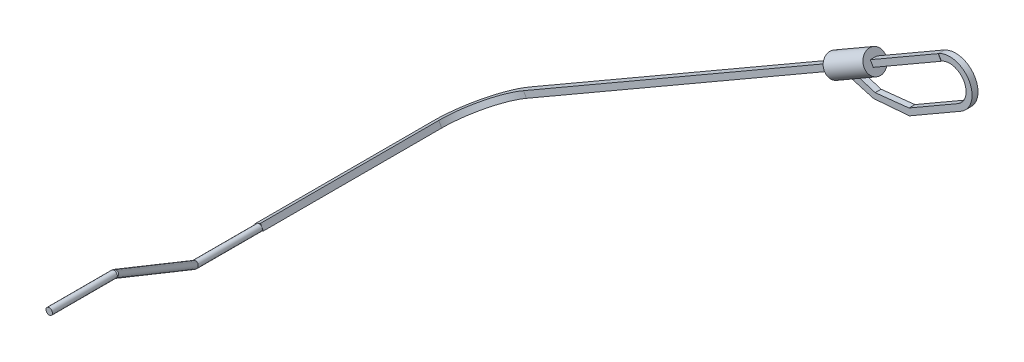
ISO-10303-21;
HEADER;
FILE_DESCRIPTION(('STEP AP214'),'2;1');
FILE_NAME('part.step','',(''),(''),'','','');
FILE_SCHEMA(('AUTOMOTIVE_DESIGN { 1 0 10303 214 1 1 1 1 }'));
ENDSEC;
DATA;
#1=APPLICATION_CONTEXT('core data for automotive mechanical design processes');
#2=APPLICATION_PROTOCOL_DEFINITION('international standard','automotive_design',2000,#1);
#3=PRODUCT_CONTEXT('',#1,'mechanical');
#4=PRODUCT('Part','Part','',(#3));
#5=PRODUCT_RELATED_PRODUCT_CATEGORY('part','',(#4));
#6=PRODUCT_DEFINITION_FORMATION('','',#4);
#7=PRODUCT_DEFINITION_CONTEXT('part definition',#1,'design');
#8=PRODUCT_DEFINITION('design','',#6,#7);
#9=PRODUCT_DEFINITION_SHAPE('','',#8);
#10=(LENGTH_UNIT() NAMED_UNIT(*) SI_UNIT(.MILLI.,.METRE.));
#11=(NAMED_UNIT(*) PLANE_ANGLE_UNIT() SI_UNIT($,.RADIAN.));
#12=(NAMED_UNIT(*) SI_UNIT($,.STERADIAN.) SOLID_ANGLE_UNIT());
#13=UNCERTAINTY_MEASURE_WITH_UNIT(LENGTH_MEASURE(1.E-05),#10,'distance_accuracy_value','');
#14=(GEOMETRIC_REPRESENTATION_CONTEXT(3) GLOBAL_UNCERTAINTY_ASSIGNED_CONTEXT((#13)) GLOBAL_UNIT_ASSIGNED_CONTEXT((#10,
#11,#12)) REPRESENTATION_CONTEXT('',''));
#15=CARTESIAN_POINT('',(0.,0.,0.));
#16=DIRECTION('',(0.,0.,1.));
#17=DIRECTION('',(1.,0.,0.));
#18=AXIS2_PLACEMENT_3D('',#15,#16,#17);
#19=CARTESIAN_POINT('',(-17.9115334794732,-10.9763139720814,-45.));
#20=DIRECTION('',(0.5,-0.866025403784439,0.));
#21=DIRECTION('',(0.866025403784439,0.5,0.));
#22=AXIS2_PLACEMENT_3D('',#19,#20,#21);
#23=PLANE('',#22);
#24=DIRECTION('',(0.866025403784438,0.5,0.));
#25=VECTOR('',#24,1.);
#26=CARTESIAN_POINT('',(-17.9115334794732,-10.9763139720814,-54.6));
#27=LINE('',#26,#25);
#28=CARTESIAN_POINT('',(-17.9115334794732,-10.9763139720814,-54.6));
#29=VERTEX_POINT('',#28);
#30=CARTESIAN_POINT('',(38.8984344593615,21.8229363100588,-54.6));
#31=VERTEX_POINT('',#30);
#32=EDGE_CURVE('E345',#29,#31,#27,.T.);
#33=ORIENTED_EDGE('',*,*,#32,.T.);
#34=DIRECTION('',(0.,0.,1.));
#35=VECTOR('',#34,1.);
#36=CARTESIAN_POINT('',(38.8984344593615,21.8229363100588,-45.));
#37=LINE('',#36,#35);
#38=CARTESIAN_POINT('',(38.8984344593615,21.8229363100588,-53.4));
#39=VERTEX_POINT('',#38);
#40=EDGE_CURVE('E63',#31,#39,#37,.T.);
#41=ORIENTED_EDGE('',*,*,#40,.T.);
#42=DIRECTION('',(-0.866025403784438,-0.5,0.));
#43=VECTOR('',#42,1.);
#44=CARTESIAN_POINT('',(58.8170187464036,33.3229363100588,-53.4));
#45=LINE('',#44,#43);
#46=CARTESIAN_POINT('',(-17.9115334794732,-10.9763139720814,-53.4));
#47=VERTEX_POINT('',#46);
#48=EDGE_CURVE('E340',#39,#47,#45,.T.);
#49=ORIENTED_EDGE('',*,*,#48,.T.);
#50=CARTESIAN_POINT('',(-17.9115334794732,-10.9763139720814,-45.));
#51=DIRECTION('',(-0.5,0.866025403784439,0.));
#52=DIRECTION('',(-0.866025403784439,-0.5,0.));
#53=AXIS2_PLACEMENT_3D('',#50,#51,#52);
#54=CIRCLE('',#53,8.4);
#55=CARTESIAN_POINT('',(-25.1861468712625,-15.1763139720814,-45.));
#56=VERTEX_POINT('',#55);
#57=EDGE_CURVE('E335',#47,#56,#54,.T.);
#58=ORIENTED_EDGE('',*,*,#57,.T.);
#59=DIRECTION('',(0.,0.,1.));
#60=VECTOR('',#59,1.);
#61=CARTESIAN_POINT('',(-25.1861468712625,-15.1763139720814,-45.));
#62=LINE('',#61,#60);
#63=CARTESIAN_POINT('',(-25.1861468712625,-15.1763139720814,-12.));
#64=VERTEX_POINT('',#63);
#65=EDGE_CURVE('E329',#56,#64,#62,.T.);
#66=ORIENTED_EDGE('',*,*,#65,.T.);
#67=DIRECTION('',(-0.866025403784439,-0.5,0.));
#68=VECTOR('',#67,1.);
#69=CARTESIAN_POINT('',(-25.1861468712625,-15.1763139720814,-12.));
#70=LINE('',#69,#68);
#71=CARTESIAN_POINT('',(-25.4980965169602,-15.3564181839986,-12.));
#72=VERTEX_POINT('',#71);
#73=EDGE_CURVE('E349',#64,#72,#70,.T.);
#74=ORIENTED_EDGE('',*,*,#73,.T.);
#75=CARTESIAN_POINT('',(-25.9134277101061,-15.5962097601643,-12.));
#76=VERTEX_POINT('',#75);
#77=EDGE_CURVE('E250',#72,#76,#70,.T.);
#78=ORIENTED_EDGE('',*,*,#77,.T.);
#79=CARTESIAN_POINT('',(-26.2253773558038,-15.7763139720814,-12.));
#80=VERTEX_POINT('',#79);
#81=EDGE_CURVE('E313',#76,#80,#70,.T.);
#82=ORIENTED_EDGE('',*,*,#81,.T.);
#83=DIRECTION('',(0.,0.,-1.));
#84=VECTOR('',#83,1.);
#85=CARTESIAN_POINT('',(-26.2253773558038,-15.7763139720814,-12.));
#86=LINE('',#85,#84);
#87=CARTESIAN_POINT('',(-26.2253773558038,-15.7763139720814,-45.));
#88=VERTEX_POINT('',#87);
#89=EDGE_CURVE('E350',#80,#88,#86,.T.);
#90=ORIENTED_EDGE('',*,*,#89,.T.);
#91=CARTESIAN_POINT('',(-17.9115334794732,-10.9763139720814,-45.));
#92=DIRECTION('',(0.5,-0.866025403784439,0.));
#93=DIRECTION('',(0.866025403784439,0.5,0.));
#94=AXIS2_PLACEMENT_3D('',#91,#92,#93);
#95=CIRCLE('',#94,9.6);
#96=EDGE_CURVE('E344',#88,#29,#95,.T.);
#97=ORIENTED_EDGE('',*,*,#96,.T.);
#98=EDGE_LOOP('',(#33,#41,#49,#58,#66,#74,#78,#82,#90,#97));
#99=FACE_BOUND('',#98,.T.);
#100=ADVANCED_FACE('F39',(#99),#23,.T.);
#101=CARTESIAN_POINT('',(-17.9115334794732,-10.9763139720814,-54.6));
#102=DIRECTION('',(0.,0.,1.));
#103=DIRECTION('',(1.,0.,0.));
#104=AXIS2_PLACEMENT_3D('',#101,#102,#103);
#105=PLANE('',#104);
#106=DIRECTION('',(-0.5,0.866025403784439,0.));
#107=VECTOR('',#106,1.);
#108=CARTESIAN_POINT('',(38.8984344593615,21.8229363100588,-54.6));
#109=LINE('',#108,#107);
#110=CARTESIAN_POINT('',(38.3484344593615,22.7755642542217,-54.6));
#111=VERTEX_POINT('',#110);
#112=EDGE_CURVE('E53',#31,#111,#109,.T.);
#113=ORIENTED_EDGE('',*,*,#112,.F.);
#114=ORIENTED_EDGE('',*,*,#32,.F.);
#115=DIRECTION('',(-0.5,0.866025403784438,0.));
#116=VECTOR('',#115,1.);
#117=CARTESIAN_POINT('',(-17.9115334794732,-10.9763139720814,-54.6));
#118=LINE('',#117,#116);
#119=CARTESIAN_POINT('',(-18.4615334794732,-10.0236860279186,-54.6));
#120=VERTEX_POINT('',#119);
#121=EDGE_CURVE('E287',#29,#120,#118,.T.);
#122=ORIENTED_EDGE('',*,*,#121,.T.);
#123=DIRECTION('',(0.866025403784438,0.5,0.));
#124=VECTOR('',#123,1.);
#125=CARTESIAN_POINT('',(-18.4615334794732,-10.0236860279186,-54.6));
#126=LINE('',#125,#124);
#127=EDGE_CURVE('E325',#120,#111,#126,.T.);
#128=ORIENTED_EDGE('',*,*,#127,.T.);
#129=EDGE_LOOP('',(#113,#114,#122,#128));
#130=FACE_BOUND('',#129,.T.);
#131=ADVANCED_FACE('F457',(#130),#105,.F.);
#132=CARTESIAN_POINT('',(58.8170187464036,33.3229363100588,-53.4));
#133=DIRECTION('',(0.,0.,-1.));
#134=DIRECTION('',(-1.,0.,0.));
#135=AXIS2_PLACEMENT_3D('',#132,#133,#134);
#136=PLANE('',#135);
#137=DIRECTION('',(0.5,-0.866025403784439,0.));
#138=VECTOR('',#137,1.);
#139=CARTESIAN_POINT('',(38.8984344593615,21.8229363100588,-53.4));
#140=LINE('',#139,#138);
#141=CARTESIAN_POINT('',(38.3484344593615,22.7755642542217,-53.4));
#142=VERTEX_POINT('',#141);
#143=EDGE_CURVE('E420',#142,#39,#140,.T.);
#144=ORIENTED_EDGE('',*,*,#143,.F.);
#145=DIRECTION('',(-0.866025403784438,-0.5,0.));
#146=VECTOR('',#145,1.);
#147=CARTESIAN_POINT('',(58.2670187464036,34.2755642542217,-53.4));
#148=LINE('',#147,#146);
#149=CARTESIAN_POINT('',(-18.4615334794732,-10.0236860279186,-53.4));
#150=VERTEX_POINT('',#149);
#151=EDGE_CURVE('E320',#142,#150,#148,.T.);
#152=ORIENTED_EDGE('',*,*,#151,.T.);
#153=DIRECTION('',(-0.5,0.866025403784438,0.));
#154=VECTOR('',#153,1.);
#155=CARTESIAN_POINT('',(-17.9115334794732,-10.9763139720814,-53.4));
#156=LINE('',#155,#154);
#157=EDGE_CURVE('E296',#47,#150,#156,.T.);
#158=ORIENTED_EDGE('',*,*,#157,.F.);
#159=ORIENTED_EDGE('',*,*,#48,.F.);
#160=EDGE_LOOP('',(#144,#152,#158,#159));
#161=FACE_BOUND('',#160,.T.);
#162=ADVANCED_FACE('F461',(#161),#136,.F.);
#163=CARTESIAN_POINT('',(-18.4615334794732,-10.0236860279186,-45.));
#164=DIRECTION('',(0.5,-0.866025403784439,0.));
#165=DIRECTION('',(0.866025403784439,0.5,0.));
#166=AXIS2_PLACEMENT_3D('',#163,#164,#165);
#167=PLANE('',#166);
#168=DIRECTION('',(0.,0.,1.));
#169=VECTOR('',#168,1.);
#170=CARTESIAN_POINT('',(38.3484344593615,22.7755642542217,-45.));
#171=LINE('',#170,#169);
#172=EDGE_CURVE('E50',#111,#142,#171,.T.);
#173=ORIENTED_EDGE('',*,*,#172,.F.);
#174=ORIENTED_EDGE('',*,*,#127,.F.);
#175=CARTESIAN_POINT('',(-18.4615334794732,-10.0236860279186,-45.));
#176=DIRECTION('',(0.5,-0.866025403784439,0.));
#177=DIRECTION('',(0.866025403784439,0.5,0.));
#178=AXIS2_PLACEMENT_3D('',#175,#176,#177);
#179=CIRCLE('',#178,9.6);
#180=CARTESIAN_POINT('',(-26.7753773558038,-14.8236860279186,-45.));
#181=VERTEX_POINT('',#180);
#182=EDGE_CURVE('E324',#181,#120,#179,.T.);
#183=ORIENTED_EDGE('',*,*,#182,.F.);
#184=DIRECTION('',(0.,0.,-1.));
#185=VECTOR('',#184,1.);
#186=CARTESIAN_POINT('',(-26.7753773558038,-14.8236860279186,-12.));
#187=LINE('',#186,#185);
#188=CARTESIAN_POINT('',(-26.7753773558038,-14.8236860279186,-12.));
#189=VERTEX_POINT('',#188);
#190=EDGE_CURVE('E330',#189,#181,#187,.T.);
#191=ORIENTED_EDGE('',*,*,#190,.F.);
#192=DIRECTION('',(-0.866025403784439,-0.5,0.));
#193=VECTOR('',#192,1.);
#194=CARTESIAN_POINT('',(-25.7361468712625,-14.2236860279186,-12.));
#195=LINE('',#194,#193);
#196=CARTESIAN_POINT('',(-26.4634277101061,-14.6435818160014,-12.));
#197=VERTEX_POINT('',#196);
#198=EDGE_CURVE('E249',#197,#189,#195,.T.);
#199=ORIENTED_EDGE('',*,*,#198,.F.);
#200=CARTESIAN_POINT('',(-26.0480965169602,-14.4037902398357,-12.));
#201=VERTEX_POINT('',#200);
#202=EDGE_CURVE('E242',#201,#197,#195,.T.);
#203=ORIENTED_EDGE('',*,*,#202,.F.);
#204=CARTESIAN_POINT('',(-25.7361468712625,-14.2236860279186,-12.));
#205=VERTEX_POINT('',#204);
#206=EDGE_CURVE('E247',#205,#201,#195,.T.);
#207=ORIENTED_EDGE('',*,*,#206,.F.);
#208=DIRECTION('',(0.,0.,1.));
#209=VECTOR('',#208,1.);
#210=CARTESIAN_POINT('',(-25.7361468712625,-14.2236860279186,-45.));
#211=LINE('',#210,#209);
#212=CARTESIAN_POINT('',(-25.7361468712625,-14.2236860279186,-45.));
#213=VERTEX_POINT('',#212);
#214=EDGE_CURVE('E306',#213,#205,#211,.T.);
#215=ORIENTED_EDGE('',*,*,#214,.F.);
#216=CARTESIAN_POINT('',(-18.4615334794732,-10.0236860279186,-45.));
#217=DIRECTION('',(-0.5,0.866025403784439,0.));
#218=DIRECTION('',(-0.866025403784439,-0.5,0.));
#219=AXIS2_PLACEMENT_3D('',#216,#217,#218);
#220=CIRCLE('',#219,8.4);
#221=EDGE_CURVE('E315',#150,#213,#220,.T.);
#222=ORIENTED_EDGE('',*,*,#221,.F.);
#223=ORIENTED_EDGE('',*,*,#151,.F.);
#224=EDGE_LOOP('',(#173,#174,#183,#191,#199,#203,#207,#215,#222,#223));
#225=FACE_BOUND('',#224,.T.);
#226=ADVANCED_FACE('F587',(#225),#167,.F.);
#227=CARTESIAN_POINT('',(-25.9807621135332,-15.,-12.));
#228=DIRECTION('',(0.,0.,1.));
#229=DIRECTION('',(1.,0.,0.));
#230=AXIS2_PLACEMENT_3D('',#227,#228,#229);
#231=PLANE('',#230);
#232=ORIENTED_EDGE('',*,*,#77,.F.);
#233=CARTESIAN_POINT('',(-25.9807621135332,-15.,-12.));
#234=DIRECTION('',(0.,0.,1.));
#235=DIRECTION('',(1.,0.,0.));
#236=AXIS2_PLACEMENT_3D('',#233,#234,#235);
#237=CIRCLE('',#236,0.6);
#238=EDGE_CURVE('E693',#76,#72,#237,.T.);
#239=ORIENTED_EDGE('',*,*,#238,.F.);
#240=EDGE_LOOP('',(#232,#239));
#241=FACE_BOUND('',#240,.T.);
#242=ADVANCED_FACE('F594',(#241),#231,.F.);
#243=CARTESIAN_POINT('',(-14.8540210311235,2.08759651440099,25.9598688092173));
#244=DIRECTION('',(-0.337064867756065,-0.517638400744404,-0.78640813894527));
#245=DIRECTION('',(0.,0.835288001955604,-0.549812653354772));
#246=AXIS2_PLACEMENT_3D('',#243,#244,#245);
#247=CYLINDRICAL_SURFACE('',#246,0.599999999999997);
#248=CARTESIAN_POINT('',(-14.8540210311235,2.08759651440099,25.9598688092173));
#249=DIRECTION('',(0.337064867756065,0.517638400744404,0.78640813894527));
#250=DIRECTION('',(0.,-0.835288001955604,0.549812653354772));
#251=AXIS2_PLACEMENT_3D('',#248,#249,#250);
#252=CIRCLE('',#251,0.599999999999997);
#253=CARTESIAN_POINT('',(-14.3512212929284,1.76019397429037,25.9598688092173));
#254=VERTEX_POINT('',#253);
#255=CARTESIAN_POINT('',(-15.3568207693187,2.41499905451165,25.9598688092173));
#256=VERTEX_POINT('',#255);
#257=EDGE_CURVE('E270',#254,#256,#252,.T.);
#258=ORIENTED_EDGE('',*,*,#257,.F.);
#259=CARTESIAN_POINT('',(-14.8540210311236,2.08759651440098,25.9598688092173));
#260=DIRECTION('',(-0.178323322060886,-0.273855296345597,-0.945094741003586));
#261=DIRECTION('',(0.515710698082972,0.791988980577008,-0.326796466516034));
#262=AXIS2_PLACEMENT_3D('',#259,#260,#261);
#263=ELLIPSE('',#262,0.634856987314166,0.599999999999998);
#264=EDGE_CURVE('E265',#254,#256,#263,.T.);
#265=ORIENTED_EDGE('',*,*,#264,.T.);
#266=EDGE_LOOP('',(#258,#265));
#267=FACE_BOUND('',#266,.T.);
#268=CARTESIAN_POINT('',(-25.9807621135332,-15.,0.));
#269=DIRECTION('',(-0.178323322060886,-0.273855296345597,-0.945094741003586));
#270=DIRECTION('',(-0.515710698082972,-0.791988980577008,0.326796466516034));
#271=AXIS2_PLACEMENT_3D('',#268,#269,#270);
#272=ELLIPSE('',#271,0.634856987314166,0.599999999999998);
#273=CARTESIAN_POINT('',(-26.4835618517283,-14.6725974598894,0.));
#274=VERTEX_POINT('',#273);
#275=CARTESIAN_POINT('',(-25.477962375338,-15.3274025401106,0.));
#276=VERTEX_POINT('',#275);
#277=EDGE_CURVE('E271',#274,#276,#272,.T.);
#278=ORIENTED_EDGE('',*,*,#277,.F.);
#279=CARTESIAN_POINT('',(-25.9807621135332,-15.,0.));
#280=DIRECTION('',(0.337064867756065,0.517638400744404,0.78640813894527));
#281=DIRECTION('',(0.,-0.835288001955604,0.549812653354772));
#282=AXIS2_PLACEMENT_3D('',#279,#280,#281);
#283=CIRCLE('',#282,0.599999999999997);
#284=EDGE_CURVE('E268',#274,#276,#283,.T.);
#285=ORIENTED_EDGE('',*,*,#284,.T.);
#286=EDGE_LOOP('',(#278,#285));
#287=FACE_BOUND('',#286,.T.);
#288=ADVANCED_FACE('F715',(#267,#287),#247,.T.);
#289=CARTESIAN_POINT('',(-14.8540210311236,2.08759651440098,37.9598688092173));
#290=DIRECTION('',(0.,0.,-1.));
#291=DIRECTION('',(-1.,0.,0.));
#292=AXIS2_PLACEMENT_3D('',#289,#290,#291);
#293=CYLINDRICAL_SURFACE('',#292,0.6);
#294=CARTESIAN_POINT('',(-14.8540210311236,2.08759651440098,37.9598688092173));
#295=DIRECTION('',(0.,0.,1.));
#296=DIRECTION('',(1.,0.,0.));
#297=AXIS2_PLACEMENT_3D('',#294,#295,#296);
#298=CIRCLE('',#297,0.6);
#299=CARTESIAN_POINT('',(-14.2540210311236,2.08759651440098,37.9598688092173));
#300=VERTEX_POINT('',#299);
#301=EDGE_CURVE('E256',#300,#300,#298,.T.);
#302=ORIENTED_EDGE('',*,*,#301,.F.);
#303=EDGE_LOOP('',(#302));
#304=FACE_BOUND('',#303,.T.);
#305=ORIENTED_EDGE('',*,*,#264,.F.);
#306=CARTESIAN_POINT('',(-14.8540210311236,2.08759651440098,25.9598688092173));
#307=DIRECTION('',(0.,0.,1.));
#308=DIRECTION('',(1.,0.,0.));
#309=AXIS2_PLACEMENT_3D('',#306,#307,#308);
#310=CIRCLE('',#309,0.6);
#311=EDGE_CURVE('E259',#254,#256,#310,.T.);
#312=ORIENTED_EDGE('',*,*,#311,.T.);
#313=EDGE_LOOP('',(#305,#312));
#314=FACE_BOUND('',#313,.T.);
#315=ADVANCED_FACE('F41',(#304,#314),#293,.T.);
#316=CARTESIAN_POINT('',(-14.8540210311236,2.08759651440098,37.9598688092173));
#317=DIRECTION('',(0.,0.,1.));
#318=DIRECTION('',(1.,0.,0.));
#319=AXIS2_PLACEMENT_3D('',#316,#317,#318);
#320=PLANE('',#319);
#321=ORIENTED_EDGE('',*,*,#301,.T.);
#322=EDGE_LOOP('',(#321));
#323=FACE_BOUND('',#322,.T.);
#324=ADVANCED_FACE('F861',(#323),#320,.T.);
#325=CARTESIAN_POINT('',(-14.8540210311236,2.08759651440098,25.9598688092173));
#326=DIRECTION('',(0.,0.,1.));
#327=DIRECTION('',(1.,0.,0.));
#328=AXIS2_PLACEMENT_3D('',#325,#326,#327);
#329=PLANE('',#328);
#330=ORIENTED_EDGE('',*,*,#311,.F.);
#331=DIRECTION('',(-0.837999563658564,0.545670900184404,0.));
#332=VECTOR('',#331,1.);
#333=CARTESIAN_POINT('',(-14.8540210311235,2.08759651440101,25.9598688092173));
#334=LINE('',#333,#332);
#335=EDGE_CURVE('E254',#254,#256,#334,.T.);
#336=ORIENTED_EDGE('',*,*,#335,.T.);
#337=EDGE_LOOP('',(#330,#336));
#338=FACE_BOUND('',#337,.T.);
#339=ADVANCED_FACE('F852',(#338),#329,.F.);
#340=CARTESIAN_POINT('',(-14.8540210311235,2.08759651440099,25.9598688092173));
#341=DIRECTION('',(0.337064867756065,0.517638400744404,0.78640813894527));
#342=DIRECTION('',(0.,-0.835288001955604,0.549812653354772));
#343=AXIS2_PLACEMENT_3D('',#340,#341,#342);
#344=PLANE('',#343);
#345=ORIENTED_EDGE('',*,*,#335,.F.);
#346=ORIENTED_EDGE('',*,*,#257,.T.);
#347=EDGE_LOOP('',(#345,#346));
#348=FACE_BOUND('',#347,.T.);
#349=ADVANCED_FACE('F848',(#348),#344,.T.);
#350=CARTESIAN_POINT('',(-25.9807621135332,-15.,0.));
#351=DIRECTION('',(0.337064867756065,0.517638400744404,0.78640813894527));
#352=DIRECTION('',(0.,-0.835288001955604,0.549812653354772));
#353=AXIS2_PLACEMENT_3D('',#350,#351,#352);
#354=PLANE('',#353);
#355=ORIENTED_EDGE('',*,*,#284,.F.);
#356=DIRECTION('',(0.837999563658564,-0.545670900184404,0.));
#357=VECTOR('',#356,1.);
#358=CARTESIAN_POINT('',(-25.9807621135332,-15.,0.));
#359=LINE('',#358,#357);
#360=EDGE_CURVE('E252',#274,#276,#359,.T.);
#361=ORIENTED_EDGE('',*,*,#360,.T.);
#362=EDGE_LOOP('',(#355,#361));
#363=FACE_BOUND('',#362,.T.);
#364=ADVANCED_FACE('F835',(#363),#354,.F.);
#365=CARTESIAN_POINT('',(-25.9807621135332,-15.,0.));
#366=DIRECTION('',(0.,0.,-1.));
#367=DIRECTION('',(-1.,0.,0.));
#368=AXIS2_PLACEMENT_3D('',#365,#366,#367);
#369=CYLINDRICAL_SURFACE('',#368,0.6);
#370=CARTESIAN_POINT('',(-25.4611468712625,-14.7,-12.));
#371=VERTEX_POINT('',#370);
#372=EDGE_CURVE('E277',#371,#201,#237,.T.);
#373=ORIENTED_EDGE('',*,*,#372,.T.);
#374=EDGE_CURVE('E276',#201,#197,#237,.T.);
#375=ORIENTED_EDGE('',*,*,#374,.T.);
#376=CARTESIAN_POINT('',(-26.5003773558038,-15.3,-12.));
#377=VERTEX_POINT('',#376);
#378=EDGE_CURVE('E688',#197,#377,#237,.T.);
#379=ORIENTED_EDGE('',*,*,#378,.T.);
#380=EDGE_CURVE('E689',#377,#76,#237,.T.);
#381=ORIENTED_EDGE('',*,*,#380,.T.);
#382=ORIENTED_EDGE('',*,*,#238,.T.);
#383=EDGE_CURVE('E278',#72,#371,#237,.T.);
#384=ORIENTED_EDGE('',*,*,#383,.T.);
#385=EDGE_LOOP('',(#373,#375,#379,#381,#382,#384));
#386=FACE_BOUND('',#385,.T.);
#387=CARTESIAN_POINT('',(-25.9807621135332,-15.,0.));
#388=DIRECTION('',(0.,0.,1.));
#389=DIRECTION('',(1.,0.,0.));
#390=AXIS2_PLACEMENT_3D('',#387,#388,#389);
#391=CIRCLE('',#390,0.6);
#392=EDGE_CURVE('E274',#274,#276,#391,.T.);
#393=ORIENTED_EDGE('',*,*,#392,.F.);
#394=ORIENTED_EDGE('',*,*,#277,.T.);
#395=EDGE_LOOP('',(#393,#394));
#396=FACE_BOUND('',#395,.T.);
#397=ADVANCED_FACE('F695',(#386,#396),#369,.T.);
#398=CARTESIAN_POINT('',(-25.9807621135332,-15.,0.));
#399=DIRECTION('',(0.,0.,1.));
#400=DIRECTION('',(1.,0.,0.));
#401=AXIS2_PLACEMENT_3D('',#398,#399,#400);
#402=PLANE('',#401);
#403=ORIENTED_EDGE('',*,*,#360,.F.);
#404=ORIENTED_EDGE('',*,*,#392,.T.);
#405=EDGE_LOOP('',(#403,#404));
#406=FACE_BOUND('',#405,.T.);
#407=ADVANCED_FACE('F699',(#406),#402,.T.);
#408=ORIENTED_EDGE('',*,*,#374,.F.);
#409=ORIENTED_EDGE('',*,*,#202,.T.);
#410=EDGE_LOOP('',(#408,#409));
#411=FACE_BOUND('',#410,.T.);
#412=ADVANCED_FACE('F700',(#411),#231,.F.);
#413=CARTESIAN_POINT('',(-25.1861468712625,-15.1763139720814,-12.));
#414=DIRECTION('',(0.,0.,-1.));
#415=DIRECTION('',(-1.,0.,0.));
#416=AXIS2_PLACEMENT_3D('',#413,#414,#415);
#417=PLANE('',#416);
#418=ORIENTED_EDGE('',*,*,#378,.F.);
#419=ORIENTED_EDGE('',*,*,#198,.T.);
#420=DIRECTION('',(-0.5,0.866025403784438,0.));
#421=VECTOR('',#420,1.);
#422=CARTESIAN_POINT('',(-26.2253773558038,-15.7763139720814,-12.));
#423=LINE('',#422,#421);
#424=EDGE_CURVE('E284',#377,#189,#423,.T.);
#425=ORIENTED_EDGE('',*,*,#424,.F.);
#426=EDGE_LOOP('',(#418,#419,#425));
#427=FACE_BOUND('',#426,.T.);
#428=ADVANCED_FACE('F684',(#427),#417,.F.);
#429=ORIENTED_EDGE('',*,*,#380,.F.);
#430=EDGE_CURVE('E285',#80,#377,#423,.T.);
#431=ORIENTED_EDGE('',*,*,#430,.F.);
#432=ORIENTED_EDGE('',*,*,#81,.F.);
#433=EDGE_LOOP('',(#429,#431,#432));
#434=FACE_BOUND('',#433,.T.);
#435=ADVANCED_FACE('F704',(#434),#417,.F.);
#436=ORIENTED_EDGE('',*,*,#372,.F.);
#437=DIRECTION('',(-0.5,0.866025403784438,0.));
#438=VECTOR('',#437,1.);
#439=CARTESIAN_POINT('',(-25.1861468712625,-15.1763139720814,-12.));
#440=LINE('',#439,#438);
#441=EDGE_CURVE('E307',#371,#205,#440,.T.);
#442=ORIENTED_EDGE('',*,*,#441,.T.);
#443=ORIENTED_EDGE('',*,*,#206,.T.);
#444=EDGE_LOOP('',(#436,#442,#443));
#445=FACE_BOUND('',#444,.T.);
#446=ADVANCED_FACE('F668',(#445),#417,.F.);
#447=ORIENTED_EDGE('',*,*,#383,.F.);
#448=ORIENTED_EDGE('',*,*,#73,.F.);
#449=EDGE_CURVE('E302',#64,#371,#440,.T.);
#450=ORIENTED_EDGE('',*,*,#449,.T.);
#451=EDGE_LOOP('',(#447,#448,#450));
#452=FACE_BOUND('',#451,.T.);
#453=ADVANCED_FACE('F669',(#452),#417,.F.);
#454=CARTESIAN_POINT('',(-26.2253773558038,-15.7763139720814,-12.));
#455=DIRECTION('',(0.866025403784438,0.5,0.));
#456=DIRECTION('',(-0.5,0.866025403784439,0.));
#457=AXIS2_PLACEMENT_3D('',#454,#455,#456);
#458=PLANE('',#457);
#459=ORIENTED_EDGE('',*,*,#190,.T.);
#460=DIRECTION('',(-0.5,0.866025403784438,0.));
#461=VECTOR('',#460,1.);
#462=CARTESIAN_POINT('',(-26.2253773558038,-15.7763139720814,-45.));
#463=LINE('',#462,#461);
#464=EDGE_CURVE('E288',#88,#181,#463,.T.);
#465=ORIENTED_EDGE('',*,*,#464,.F.);
#466=ORIENTED_EDGE('',*,*,#89,.F.);
#467=ORIENTED_EDGE('',*,*,#430,.T.);
#468=ORIENTED_EDGE('',*,*,#424,.T.);
#469=EDGE_LOOP('',(#459,#465,#466,#467,#468));
#470=FACE_BOUND('',#469,.T.);
#471=ADVANCED_FACE('F649',(#470),#458,.F.);
#472=CARTESIAN_POINT('',(-17.9115334794732,-10.9763139720814,-45.));
#473=DIRECTION('',(-0.5,0.866025403784438,0.));
#474=DIRECTION('',(-0.866025403784439,-0.5,0.));
#475=AXIS2_PLACEMENT_3D('',#472,#473,#474);
#476=CYLINDRICAL_SURFACE('',#475,9.6);
#477=ORIENTED_EDGE('',*,*,#182,.T.);
#478=ORIENTED_EDGE('',*,*,#121,.F.);
#479=ORIENTED_EDGE('',*,*,#96,.F.);
#480=ORIENTED_EDGE('',*,*,#464,.T.);
#481=EDGE_LOOP('',(#477,#478,#479,#480));
#482=FACE_BOUND('',#481,.T.);
#483=ADVANCED_FACE('F642',(#482),#476,.T.);
#484=CARTESIAN_POINT('',(-17.9115334794732,-10.9763139720814,-45.));
#485=DIRECTION('',(-0.5,0.866025403784438,0.));
#486=DIRECTION('',(-0.866025403784439,-0.5,0.));
#487=AXIS2_PLACEMENT_3D('',#484,#485,#486);
#488=CYLINDRICAL_SURFACE('',#487,8.4);
#489=ORIENTED_EDGE('',*,*,#221,.T.);
#490=DIRECTION('',(-0.5,0.866025403784438,0.));
#491=VECTOR('',#490,1.);
#492=CARTESIAN_POINT('',(-25.1861468712625,-15.1763139720814,-45.));
#493=LINE('',#492,#491);
#494=EDGE_CURVE('E303',#56,#213,#493,.T.);
#495=ORIENTED_EDGE('',*,*,#494,.F.);
#496=ORIENTED_EDGE('',*,*,#57,.F.);
#497=ORIENTED_EDGE('',*,*,#157,.T.);
#498=EDGE_LOOP('',(#489,#495,#496,#497));
#499=FACE_BOUND('',#498,.T.);
#500=ADVANCED_FACE('F645',(#499),#488,.F.);
#501=CARTESIAN_POINT('',(-25.1861468712625,-15.1763139720814,-45.));
#502=DIRECTION('',(-0.866025403784438,-0.5,0.));
#503=DIRECTION('',(0.5,-0.866025403784439,0.));
#504=AXIS2_PLACEMENT_3D('',#501,#502,#503);
#505=PLANE('',#504);
#506=ORIENTED_EDGE('',*,*,#214,.T.);
#507=ORIENTED_EDGE('',*,*,#441,.F.);
#508=ORIENTED_EDGE('',*,*,#449,.F.);
#509=ORIENTED_EDGE('',*,*,#65,.F.);
#510=ORIENTED_EDGE('',*,*,#494,.T.);
#511=EDGE_LOOP('',(#506,#507,#508,#509,#510));
#512=FACE_BOUND('',#511,.T.);
#513=ADVANCED_FACE('F434',(#512),#505,.F.);
#514=CARTESIAN_POINT('',(45.9846503915292,26.5492502821402,-54.));
#515=DIRECTION('',(-0.866025403784439,-0.5,0.));
#516=DIRECTION('',(0.5,-0.866025403784439,0.));
#517=AXIS2_PLACEMENT_3D('',#514,#515,#516);
#518=CYLINDRICAL_SURFACE('',#517,2.);
#519=CARTESIAN_POINT('',(45.9846503915292,26.5492502821402,-54.));
#520=DIRECTION('',(0.866025403784439,0.5,0.));
#521=DIRECTION('',(-0.5,0.866025403784439,0.));
#522=AXIS2_PLACEMENT_3D('',#519,#520,#521);
#523=CIRCLE('',#522,2.);
#524=CARTESIAN_POINT('',(44.9846503915292,28.2813010897091,-54.));
#525=VERTEX_POINT('',#524);
#526=EDGE_CURVE('E424',#525,#525,#523,.T.);
#527=ORIENTED_EDGE('',*,*,#526,.F.);
#528=EDGE_LOOP('',(#527));
#529=FACE_BOUND('',#528,.T.);
#530=CARTESIAN_POINT('',(38.6234344593615,22.2992502821402,-54.));
#531=DIRECTION('',(0.866025403784439,0.5,0.));
#532=DIRECTION('',(-0.5,0.866025403784439,0.));
#533=AXIS2_PLACEMENT_3D('',#530,#531,#532);
#534=CIRCLE('',#533,2.);
#535=CARTESIAN_POINT('',(37.6234344593615,24.0313010897091,-54.));
#536=VERTEX_POINT('',#535);
#537=EDGE_CURVE('E422',#536,#536,#534,.T.);
#538=ORIENTED_EDGE('',*,*,#537,.T.);
#539=EDGE_LOOP('',(#538));
#540=FACE_BOUND('',#539,.T.);
#541=DIRECTION('',(-0.866025403784439,-0.5,0.));
#542=VECTOR('',#541,1.);
#543=CARTESIAN_POINT('',(46.9460946176807,24.8839800338021,-53.45));
#544=LINE('',#543,#542);
#545=CARTESIAN_POINT('',(42.2656611275311,22.1817304983401,-53.45));
#546=VERTEX_POINT('',#545);
#547=CARTESIAN_POINT('',(43.726376102643,23.0250746824303,-53.45));
#548=VERTEX_POINT('',#547);
#549=EDGE_CURVE('E232',#546,#548,#544,.F.);
#550=ORIENTED_EDGE('',*,*,#549,.T.);
#551=CARTESIAN_POINT('',(41.2215106707148,23.7992502821402,-54.));
#552=DIRECTION('',(-0.295286936198048,-0.955408616933493,0.));
#553=DIRECTION('',(-0.955408616933493,0.295286936198048,0.));
#554=AXIS2_PLACEMENT_3D('',#551,#552,#553);
#555=ELLIPSE('',#554,2.72691216768267,2.);
#556=CARTESIAN_POINT('',(43.726376102643,23.0250746824303,-54.55));
#557=VERTEX_POINT('',#556);
#558=EDGE_CURVE('E239',#548,#557,#555,.F.);
#559=ORIENTED_EDGE('',*,*,#558,.T.);
#560=DIRECTION('',(-0.866025403784439,-0.5,0.));
#561=VECTOR('',#560,1.);
#562=CARTESIAN_POINT('',(46.9460946176807,24.8839800338021,-54.55));
#563=LINE('',#562,#561);
#564=CARTESIAN_POINT('',(42.2656611275311,22.1817304983401,-54.55));
#565=VERTEX_POINT('',#564);
#566=EDGE_CURVE('E238',#565,#557,#563,.F.);
#567=ORIENTED_EDGE('',*,*,#566,.F.);
#568=CARTESIAN_POINT('',(39.679563000562,22.9090063797012,-54.));
#569=DIRECTION('',(0.270723424827323,0.962657170154445,0.));
#570=DIRECTION('',(-0.962657170154445,0.270723424827323,0.));
#571=AXIS2_PLACEMENT_3D('',#568,#569,#570);
#572=ELLIPSE('',#571,2.79414702275506,2.);
#573=EDGE_CURVE('E224',#565,#546,#572,.F.);
#574=ORIENTED_EDGE('',*,*,#573,.T.);
#575=EDGE_LOOP('',(#550,#559,#567,#574));
#576=FACE_BOUND('',#575,.T.);
#577=ADVANCED_FACE('F241',(#529,#540,#576),#518,.T.);
#578=CARTESIAN_POINT('',(45.9846503915292,26.5492502821402,-54.));
#579=DIRECTION('',(0.866025403784439,0.5,0.));
#580=DIRECTION('',(-0.5,0.866025403784439,0.));
#581=AXIS2_PLACEMENT_3D('',#578,#579,#580);
#582=PLANE('',#581);
#583=DIRECTION('',(-0.5,0.866025403784439,0.));
#584=VECTOR('',#583,1.);
#585=CARTESIAN_POINT('',(46.2596503915292,26.0729363100588,-54.6));
#586=LINE('',#585,#584);
#587=CARTESIAN_POINT('',(46.2596503915292,26.0729363100588,-54.6));
#588=VERTEX_POINT('',#587);
#589=CARTESIAN_POINT('',(45.7096503915292,27.0255642542217,-54.6));
#590=VERTEX_POINT('',#589);
#591=EDGE_CURVE('E413',#588,#590,#586,.T.);
#592=ORIENTED_EDGE('',*,*,#591,.F.);
#593=DIRECTION('',(0.,0.,1.));
#594=VECTOR('',#593,1.);
#595=CARTESIAN_POINT('',(46.2596503915292,26.0729363100588,-45.));
#596=LINE('',#595,#594);
#597=CARTESIAN_POINT('',(46.2596503915292,26.0729363100588,-53.4));
#598=VERTEX_POINT('',#597);
#599=EDGE_CURVE('E397',#588,#598,#596,.T.);
#600=ORIENTED_EDGE('',*,*,#599,.T.);
#601=DIRECTION('',(0.5,-0.866025403784439,0.));
#602=VECTOR('',#601,1.);
#603=CARTESIAN_POINT('',(46.2596503915292,26.0729363100588,-53.4));
#604=LINE('',#603,#602);
#605=CARTESIAN_POINT('',(45.7096503915292,27.0255642542217,-53.4));
#606=VERTEX_POINT('',#605);
#607=EDGE_CURVE('E412',#606,#598,#604,.T.);
#608=ORIENTED_EDGE('',*,*,#607,.F.);
#609=DIRECTION('',(0.,0.,1.));
#610=VECTOR('',#609,1.);
#611=CARTESIAN_POINT('',(45.7096503915292,27.0255642542217,-45.));
#612=LINE('',#611,#610);
#613=EDGE_CURVE('E11',#590,#606,#612,.T.);
#614=ORIENTED_EDGE('',*,*,#613,.F.);
#615=EDGE_LOOP('',(#592,#600,#608,#614));
#616=FACE_BOUND('',#615,.T.);
#617=ORIENTED_EDGE('',*,*,#526,.T.);
#618=EDGE_LOOP('',(#617));
#619=FACE_BOUND('',#618,.T.);
#620=ADVANCED_FACE('F431',(#616,#619),#582,.T.);
#621=CARTESIAN_POINT('',(38.6234344593615,22.2992502821402,-54.));
#622=DIRECTION('',(0.866025403784439,0.5,0.));
#623=DIRECTION('',(-0.5,0.866025403784439,0.));
#624=AXIS2_PLACEMENT_3D('',#621,#622,#623);
#625=PLANE('',#624);
#626=ORIENTED_EDGE('',*,*,#40,.F.);
#627=ORIENTED_EDGE('',*,*,#112,.T.);
#628=ORIENTED_EDGE('',*,*,#172,.T.);
#629=ORIENTED_EDGE('',*,*,#143,.T.);
#630=EDGE_LOOP('',(#626,#627,#628,#629));
#631=FACE_BOUND('',#630,.T.);
#632=ORIENTED_EDGE('',*,*,#537,.F.);
#633=EDGE_LOOP('',(#632));
#634=FACE_BOUND('',#633,.T.);
#635=ADVANCED_FACE('F438',(#631,#634),#625,.F.);
#636=CARTESIAN_POINT('',(58.8170187464036,33.3229363100588,-54.6));
#637=DIRECTION('',(-0.866025403784438,-0.5,0.));
#638=DIRECTION('',(0.5,-0.866025403784439,0.));
#639=AXIS2_PLACEMENT_3D('',#636,#637,#638);
#640=PLANE('',#639);
#641=DIRECTION('',(0.5,-0.866025403784439,0.));
#642=VECTOR('',#641,1.);
#643=CARTESIAN_POINT('',(58.8170187464036,33.3229363100588,-53.45));
#644=LINE('',#643,#642);
#645=CARTESIAN_POINT('',(58.2670187464036,34.2755642542217,-53.45));
#646=VERTEX_POINT('',#645);
#647=CARTESIAN_POINT('',(58.8170187464036,33.3229363100588,-53.45));
#648=VERTEX_POINT('',#647);
#649=EDGE_CURVE('E355',#646,#648,#644,.T.);
#650=ORIENTED_EDGE('',*,*,#649,.F.);
#651=DIRECTION('',(0.,0.,1.));
#652=VECTOR('',#651,1.);
#653=CARTESIAN_POINT('',(58.2670187464036,34.2755642542217,-54.6));
#654=LINE('',#653,#652);
#655=CARTESIAN_POINT('',(58.2670187464036,34.2755642542217,-53.4));
#656=VERTEX_POINT('',#655);
#657=EDGE_CURVE('E321',#646,#656,#654,.T.);
#658=ORIENTED_EDGE('',*,*,#657,.T.);
#659=DIRECTION('',(-0.5,0.866025403784438,0.));
#660=VECTOR('',#659,1.);
#661=CARTESIAN_POINT('',(58.8170187464036,33.3229363100588,-53.4));
#662=LINE('',#661,#660);
#663=CARTESIAN_POINT('',(58.8170187464036,33.3229363100588,-53.4));
#664=VERTEX_POINT('',#663);
#665=EDGE_CURVE('E293',#664,#656,#662,.T.);
#666=ORIENTED_EDGE('',*,*,#665,.F.);
#667=DIRECTION('',(0.,0.,1.));
#668=VECTOR('',#667,1.);
#669=CARTESIAN_POINT('',(58.8170187464036,33.3229363100588,-54.6));
#670=LINE('',#669,#668);
#671=EDGE_CURVE('E343',#648,#664,#670,.T.);
#672=ORIENTED_EDGE('',*,*,#671,.F.);
#673=EDGE_LOOP('',(#650,#658,#666,#672));
#674=FACE_BOUND('',#673,.T.);
#675=ADVANCED_FACE('F442',(#674),#640,.F.);
#676=CARTESIAN_POINT('',(62.4170187464036,27.0875534028108,-53.45));
#677=DIRECTION('',(-0.5,0.866025403784439,0.));
#678=DIRECTION('',(-0.866025403784439,-0.5,0.));
#679=AXIS2_PLACEMENT_3D('',#676,#677,#678);
#680=PLANE('',#679);
#681=DIRECTION('',(0.866025403784439,0.5,0.));
#682=VECTOR('',#681,1.);
#683=CARTESIAN_POINT('',(62.4170187464036,27.0875534028108,-54.55));
#684=LINE('',#683,#682);
#685=CARTESIAN_POINT('',(52.8907393047748,21.5875534028108,-54.55));
#686=VERTEX_POINT('',#685);
#687=CARTESIAN_POINT('',(62.4170187464036,27.0875534028108,-54.55));
#688=VERTEX_POINT('',#687);
#689=EDGE_CURVE('E383',#686,#688,#684,.T.);
#690=ORIENTED_EDGE('',*,*,#689,.T.);
#691=DIRECTION('',(0.,0.,-1.));
#692=VECTOR('',#691,1.);
#693=CARTESIAN_POINT('',(62.4170187464036,27.0875534028108,-53.45));
#694=LINE('',#693,#692);
#695=CARTESIAN_POINT('',(62.4170187464036,27.0875534028108,-53.45));
#696=VERTEX_POINT('',#695);
#697=EDGE_CURVE('E373',#696,#688,#694,.T.);
#698=ORIENTED_EDGE('',*,*,#697,.F.);
#699=DIRECTION('',(0.866025403784439,0.5,0.));
#700=VECTOR('',#699,1.);
#701=CARTESIAN_POINT('',(62.4170187464036,27.0875534028108,-53.45));
#702=LINE('',#701,#700);
#703=CARTESIAN_POINT('',(52.8907393047748,21.5875534028108,-53.45));
#704=VERTEX_POINT('',#703);
#705=EDGE_CURVE('E402',#704,#696,#702,.T.);
#706=ORIENTED_EDGE('',*,*,#705,.F.);
#707=DIRECTION('',(0.,0.,-1.));
#708=VECTOR('',#707,1.);
#709=CARTESIAN_POINT('',(52.8907393047748,21.5875534028108,-53.45));
#710=LINE('',#709,#708);
#711=EDGE_CURVE('E367',#704,#686,#710,.T.);
#712=ORIENTED_EDGE('',*,*,#711,.T.);
#713=EDGE_LOOP('',(#690,#698,#706,#712));
#714=FACE_BOUND('',#713,.T.);
#715=ADVANCED_FACE('F447',(#714),#680,.F.);
#716=CARTESIAN_POINT('',(60.3420187464036,30.6815588285162,-53.45));
#717=DIRECTION('',(0.,0.,-1.));
#718=DIRECTION('',(-1.,0.,0.));
#719=AXIS2_PLACEMENT_3D('',#716,#717,#718);
#720=CYLINDRICAL_SURFACE('',#719,4.15);
#721=CARTESIAN_POINT('',(60.3420187464036,30.6815588285162,-54.55));
#722=DIRECTION('',(0.,0.,1.));
#723=DIRECTION('',(-1.,0.,0.));
#724=AXIS2_PLACEMENT_3D('',#721,#722,#723);
#725=CIRCLE('',#724,4.15);
#726=CARTESIAN_POINT('',(58.2670187464036,34.2755642542217,-54.55));
#727=VERTEX_POINT('',#726);
#728=EDGE_CURVE('E379',#688,#727,#725,.T.);
#729=ORIENTED_EDGE('',*,*,#728,.T.);
#730=DIRECTION('',(0.,0.,-1.));
#731=VECTOR('',#730,1.);
#732=CARTESIAN_POINT('',(58.2670187464036,34.2755642542217,-53.45));
#733=LINE('',#732,#731);
#734=EDGE_CURVE('E376',#646,#727,#733,.T.);
#735=ORIENTED_EDGE('',*,*,#734,.F.);
#736=CARTESIAN_POINT('',(60.3420187464036,30.6815588285162,-53.45));
#737=DIRECTION('',(0.,0.,1.));
#738=DIRECTION('',(-1.,0.,0.));
#739=AXIS2_PLACEMENT_3D('',#736,#737,#738);
#740=CIRCLE('',#739,4.15);
#741=EDGE_CURVE('E377',#696,#646,#740,.T.);
#742=ORIENTED_EDGE('',*,*,#741,.F.);
#743=ORIENTED_EDGE('',*,*,#697,.T.);
#744=EDGE_LOOP('',(#729,#735,#742,#743));
#745=FACE_BOUND('',#744,.T.);
#746=ADVANCED_FACE('F501',(#745),#720,.T.);
#747=CARTESIAN_POINT('',(58.2670187464036,34.2755642542217,-54.6));
#748=VERTEX_POINT('',#747);
#749=EDGE_CURVE('E318',#748,#727,#654,.T.);
#750=ORIENTED_EDGE('',*,*,#749,.T.);
#751=DIRECTION('',(0.5,-0.866025403784439,0.));
#752=VECTOR('',#751,1.);
#753=CARTESIAN_POINT('',(58.8170187464036,33.3229363100588,-54.55));
#754=LINE('',#753,#752);
#755=CARTESIAN_POINT('',(58.8170187464036,33.3229363100588,-54.55));
#756=VERTEX_POINT('',#755);
#757=EDGE_CURVE('E352',#727,#756,#754,.T.);
#758=ORIENTED_EDGE('',*,*,#757,.T.);
#759=CARTESIAN_POINT('',(58.8170187464036,33.3229363100588,-54.6));
#760=VERTEX_POINT('',#759);
#761=EDGE_CURVE('E336',#760,#756,#670,.T.);
#762=ORIENTED_EDGE('',*,*,#761,.F.);
#763=DIRECTION('',(-0.5,0.866025403784438,0.));
#764=VECTOR('',#763,1.);
#765=CARTESIAN_POINT('',(58.8170187464036,33.3229363100588,-54.6));
#766=LINE('',#765,#764);
#767=EDGE_CURVE('E295',#760,#748,#766,.T.);
#768=ORIENTED_EDGE('',*,*,#767,.T.);
#769=EDGE_LOOP('',(#750,#758,#762,#768));
#770=FACE_BOUND('',#769,.T.);
#771=ADVANCED_FACE('F455',(#770),#640,.F.);
#772=EDGE_CURVE('E322',#590,#748,#126,.T.);
#773=ORIENTED_EDGE('',*,*,#772,.F.);
#774=ORIENTED_EDGE('',*,*,#613,.T.);
#775=EDGE_CURVE('E314',#656,#606,#148,.T.);
#776=ORIENTED_EDGE('',*,*,#775,.F.);
#777=ORIENTED_EDGE('',*,*,#657,.F.);
#778=ORIENTED_EDGE('',*,*,#734,.T.);
#779=ORIENTED_EDGE('',*,*,#749,.F.);
#780=EDGE_LOOP('',(#773,#774,#776,#777,#778,#779));
#781=FACE_BOUND('',#780,.T.);
#782=ADVANCED_FACE('F496',(#781),#167,.F.);
#783=ORIENTED_EDGE('',*,*,#775,.T.);
#784=ORIENTED_EDGE('',*,*,#607,.T.);
#785=EDGE_CURVE('E331',#664,#598,#45,.T.);
#786=ORIENTED_EDGE('',*,*,#785,.F.);
#787=ORIENTED_EDGE('',*,*,#665,.T.);
#788=EDGE_LOOP('',(#783,#784,#786,#787));
#789=FACE_BOUND('',#788,.T.);
#790=ADVANCED_FACE('F476',(#789),#136,.F.);
#791=EDGE_CURVE('E342',#588,#760,#27,.T.);
#792=ORIENTED_EDGE('',*,*,#791,.F.);
#793=ORIENTED_EDGE('',*,*,#591,.T.);
#794=ORIENTED_EDGE('',*,*,#772,.T.);
#795=ORIENTED_EDGE('',*,*,#767,.F.);
#796=EDGE_LOOP('',(#792,#793,#794,#795));
#797=FACE_BOUND('',#796,.T.);
#798=ADVANCED_FACE('F464',(#797),#105,.F.);
#799=ORIENTED_EDGE('',*,*,#599,.F.);
#800=ORIENTED_EDGE('',*,*,#791,.T.);
#801=ORIENTED_EDGE('',*,*,#761,.T.);
#802=DIRECTION('',(0.,0.,-1.));
#803=VECTOR('',#802,1.);
#804=CARTESIAN_POINT('',(58.8170187464036,33.3229363100588,-53.45));
#805=LINE('',#804,#803);
#806=EDGE_CURVE('E360',#648,#756,#805,.T.);
#807=ORIENTED_EDGE('',*,*,#806,.F.);
#808=ORIENTED_EDGE('',*,*,#671,.T.);
#809=ORIENTED_EDGE('',*,*,#785,.T.);
#810=EDGE_LOOP('',(#799,#800,#801,#807,#808,#809));
#811=FACE_BOUND('',#810,.T.);
#812=ADVANCED_FACE('F456',(#811),#23,.T.);
#813=CARTESIAN_POINT('',(60.3420187464036,30.6815588285162,-53.45));
#814=DIRECTION('',(0.,0.,-1.));
#815=DIRECTION('',(-1.,0.,0.));
#816=AXIS2_PLACEMENT_3D('',#813,#814,#815);
#817=CYLINDRICAL_SURFACE('',#816,3.05);
#818=CARTESIAN_POINT('',(60.3420187464036,30.6815588285162,-54.55));
#819=DIRECTION('',(0.,0.,-1.));
#820=DIRECTION('',(1.,0.,0.));
#821=AXIS2_PLACEMENT_3D('',#818,#819,#820);
#822=CIRCLE('',#821,3.05);
#823=CARTESIAN_POINT('',(61.8670187464036,28.0401813469737,-54.55));
#824=VERTEX_POINT('',#823);
#825=EDGE_CURVE('E400',#756,#824,#822,.T.);
#826=ORIENTED_EDGE('',*,*,#825,.T.);
#827=DIRECTION('',(0.,0.,-1.));
#828=VECTOR('',#827,1.);
#829=CARTESIAN_POINT('',(61.8670187464036,28.0401813469737,-53.45));
#830=LINE('',#829,#828);
#831=CARTESIAN_POINT('',(61.8670187464036,28.0401813469737,-53.45));
#832=VERTEX_POINT('',#831);
#833=EDGE_CURVE('E359',#832,#824,#830,.T.);
#834=ORIENTED_EDGE('',*,*,#833,.F.);
#835=CARTESIAN_POINT('',(60.3420187464036,30.6815588285162,-53.45));
#836=DIRECTION('',(0.,0.,-1.));
#837=DIRECTION('',(1.,0.,0.));
#838=AXIS2_PLACEMENT_3D('',#835,#836,#837);
#839=CIRCLE('',#838,3.05);
#840=EDGE_CURVE('E382',#648,#832,#839,.T.);
#841=ORIENTED_EDGE('',*,*,#840,.F.);
#842=ORIENTED_EDGE('',*,*,#806,.T.);
#843=EDGE_LOOP('',(#826,#834,#841,#842));
#844=FACE_BOUND('',#843,.T.);
#845=ADVANCED_FACE('F467',(#844),#817,.F.);
#846=CARTESIAN_POINT('',(52.8170532768562,22.8151813469737,-53.45));
#847=DIRECTION('',(0.5,-0.866025403784439,0.));
#848=DIRECTION('',(0.866025403784439,0.5,0.));
#849=AXIS2_PLACEMENT_3D('',#846,#847,#848);
#850=PLANE('',#849);
#851=DIRECTION('',(-0.866025403784439,-0.5,0.));
#852=VECTOR('',#851,1.);
#853=CARTESIAN_POINT('',(52.8170532768562,22.8151813469737,-54.55));
#854=LINE('',#853,#852);
#855=CARTESIAN_POINT('',(52.8170532768562,22.8151813469737,-54.55));
#856=VERTEX_POINT('',#855);
#857=EDGE_CURVE('E394',#824,#856,#854,.T.);
#858=ORIENTED_EDGE('',*,*,#857,.T.);
#859=DIRECTION('',(0.,0.,-1.));
#860=VECTOR('',#859,1.);
#861=CARTESIAN_POINT('',(52.8170532768562,22.8151813469737,-53.45));
#862=LINE('',#861,#860);
#863=CARTESIAN_POINT('',(52.8170532768562,22.8151813469737,-53.45));
#864=VERTEX_POINT('',#863);
#865=EDGE_CURVE('E361',#864,#856,#862,.T.);
#866=ORIENTED_EDGE('',*,*,#865,.F.);
#867=DIRECTION('',(-0.866025403784439,-0.5,0.));
#868=VECTOR('',#867,1.);
#869=CARTESIAN_POINT('',(52.8170532768562,22.8151813469737,-53.45));
#870=LINE('',#869,#868);
#871=EDGE_CURVE('E410',#832,#864,#870,.T.);
#872=ORIENTED_EDGE('',*,*,#871,.F.);
#873=ORIENTED_EDGE('',*,*,#833,.T.);
#874=EDGE_LOOP('',(#858,#866,#872,#873));
#875=FACE_BOUND('',#874,.T.);
#876=ADVANCED_FACE('F478',(#875),#850,.F.);
#877=CARTESIAN_POINT('',(46.5624072050957,22.148546126624,-53.45));
#878=DIRECTION('',(0.105982136439584,-0.99436803385653,0.));
#879=DIRECTION('',(0.99436803385653,0.105982136439584,0.));
#880=AXIS2_PLACEMENT_3D('',#877,#878,#879);
#881=PLANE('',#880);
#882=DIRECTION('',(-0.99436803385653,-0.105982136439584,0.));
#883=VECTOR('',#882,1.);
#884=CARTESIAN_POINT('',(46.5624072050957,22.148546126624,-54.55));
#885=LINE('',#884,#883);
#886=CARTESIAN_POINT('',(46.5624072050957,22.148546126624,-54.55));
#887=VERTEX_POINT('',#886);
#888=EDGE_CURVE('E391',#856,#887,#885,.T.);
#889=ORIENTED_EDGE('',*,*,#888,.T.);
#890=DIRECTION('',(0.,0.,-1.));
#891=VECTOR('',#890,1.);
#892=CARTESIAN_POINT('',(46.5624072050957,22.148546126624,-53.45));
#893=LINE('',#892,#891);
#894=CARTESIAN_POINT('',(46.5624072050957,22.148546126624,-53.45));
#895=VERTEX_POINT('',#894);
#896=EDGE_CURVE('E368',#895,#887,#893,.T.);
#897=ORIENTED_EDGE('',*,*,#896,.F.);
#898=DIRECTION('',(-0.99436803385653,-0.105982136439584,0.));
#899=VECTOR('',#898,1.);
#900=CARTESIAN_POINT('',(46.5624072050957,22.148546126624,-53.45));
#901=LINE('',#900,#899);
#902=EDGE_CURVE('E403',#864,#895,#901,.T.);
#903=ORIENTED_EDGE('',*,*,#902,.F.);
#904=ORIENTED_EDGE('',*,*,#865,.T.);
#905=EDGE_LOOP('',(#889,#897,#903,#904));
#906=FACE_BOUND('',#905,.T.);
#907=ADVANCED_FACE('F520',(#906),#881,.F.);
#908=CARTESIAN_POINT('',(52.8907393047748,21.5875534028108,-53.45));
#909=DIRECTION('',(-0.0800646510941781,0.996789672721968,0.));
#910=DIRECTION('',(-0.996789672721968,-0.0800646510941781,0.));
#911=AXIS2_PLACEMENT_3D('',#908,#909,#910);
#912=PLANE('',#911);
#913=DIRECTION('',(0.996789672721968,0.0800646510941781,0.));
#914=VECTOR('',#913,1.);
#915=CARTESIAN_POINT('',(52.8907393047748,21.5875534028108,-54.55));
#916=LINE('',#915,#914);
#917=CARTESIAN_POINT('',(46.2695868820681,21.0557258035965,-54.55));
#918=VERTEX_POINT('',#917);
#919=EDGE_CURVE('E387',#918,#686,#916,.T.);
#920=ORIENTED_EDGE('',*,*,#919,.T.);
#921=ORIENTED_EDGE('',*,*,#711,.F.);
#922=DIRECTION('',(0.996789672721968,0.0800646510941781,0.));
#923=VECTOR('',#922,1.);
#924=CARTESIAN_POINT('',(52.8907393047748,21.5875534028108,-53.45));
#925=LINE('',#924,#923);
#926=CARTESIAN_POINT('',(46.2695868820681,21.0557258035965,-53.45));
#927=VERTEX_POINT('',#926);
#928=EDGE_CURVE('E227',#927,#704,#925,.T.);
#929=ORIENTED_EDGE('',*,*,#928,.F.);
#930=DIRECTION('',(0.,0.,-1.));
#931=VECTOR('',#930,1.);
#932=CARTESIAN_POINT('',(46.2695868820681,21.0557258035965,-53.45));
#933=LINE('',#932,#931);
#934=EDGE_CURVE('E228',#927,#918,#933,.T.);
#935=ORIENTED_EDGE('',*,*,#934,.T.);
#936=EDGE_LOOP('',(#920,#921,#929,#935));
#937=FACE_BOUND('',#936,.T.);
#938=ADVANCED_FACE('F525',(#937),#912,.F.);
#939=CARTESIAN_POINT('',(41.2215106707148,23.7992502821402,-53.45));
#940=DIRECTION('',(-0.295286936198048,-0.955408616933493,0.));
#941=DIRECTION('',(0.955408616933493,-0.295286936198048,0.));
#942=AXIS2_PLACEMENT_3D('',#939,#940,#941);
#943=PLANE('',#942);
#944=ORIENTED_EDGE('',*,*,#558,.F.);
#945=DIRECTION('',(-0.955408616933493,0.295286936198048,0.));
#946=VECTOR('',#945,1.);
#947=CARTESIAN_POINT('',(41.2215106707148,23.7992502821402,-53.45));
#948=LINE('',#947,#946);
#949=EDGE_CURVE('E229',#895,#548,#948,.T.);
#950=ORIENTED_EDGE('',*,*,#949,.F.);
#951=ORIENTED_EDGE('',*,*,#896,.T.);
#952=DIRECTION('',(-0.955408616933493,0.295286936198048,0.));
#953=VECTOR('',#952,1.);
#954=CARTESIAN_POINT('',(41.2215106707148,23.7992502821402,-54.55));
#955=LINE('',#954,#953);
#956=EDGE_CURVE('E388',#887,#557,#955,.T.);
#957=ORIENTED_EDGE('',*,*,#956,.T.);
#958=EDGE_LOOP('',(#944,#950,#951,#957));
#959=FACE_BOUND('',#958,.T.);
#960=ADVANCED_FACE('F519',(#959),#943,.F.);
#961=CARTESIAN_POINT('',(46.2695868820681,21.0557258035965,-53.45));
#962=DIRECTION('',(0.270723424827323,0.962657170154445,0.));
#963=DIRECTION('',(-0.962657170154446,0.270723424827323,0.));
#964=AXIS2_PLACEMENT_3D('',#961,#962,#963);
#965=PLANE('',#964);
#966=ORIENTED_EDGE('',*,*,#573,.F.);
#967=DIRECTION('',(0.962657170154445,-0.270723424827323,0.));
#968=VECTOR('',#967,1.);
#969=CARTESIAN_POINT('',(46.2695868820681,21.0557258035965,-54.55));
#970=LINE('',#969,#968);
#971=EDGE_CURVE('E389',#565,#918,#970,.T.);
#972=ORIENTED_EDGE('',*,*,#971,.T.);
#973=ORIENTED_EDGE('',*,*,#934,.F.);
#974=DIRECTION('',(0.962657170154445,-0.270723424827323,0.));
#975=VECTOR('',#974,1.);
#976=CARTESIAN_POINT('',(46.2695868820681,21.0557258035965,-53.45));
#977=LINE('',#976,#975);
#978=EDGE_CURVE('E218',#546,#927,#977,.T.);
#979=ORIENTED_EDGE('',*,*,#978,.F.);
#980=EDGE_LOOP('',(#966,#972,#973,#979));
#981=FACE_BOUND('',#980,.T.);
#982=ADVANCED_FACE('F222',(#981),#965,.F.);
#983=CARTESIAN_POINT('',(60.3420187464036,30.6815588285162,-54.55));
#984=DIRECTION('',(0.,0.,-1.));
#985=DIRECTION('',(-1.,0.,0.));
#986=AXIS2_PLACEMENT_3D('',#983,#984,#985);
#987=PLANE('',#986);
#988=ORIENTED_EDGE('',*,*,#971,.F.);
#989=ORIENTED_EDGE('',*,*,#566,.T.);
#990=ORIENTED_EDGE('',*,*,#956,.F.);
#991=ORIENTED_EDGE('',*,*,#888,.F.);
#992=ORIENTED_EDGE('',*,*,#857,.F.);
#993=ORIENTED_EDGE('',*,*,#825,.F.);
#994=ORIENTED_EDGE('',*,*,#757,.F.);
#995=ORIENTED_EDGE('',*,*,#728,.F.);
#996=ORIENTED_EDGE('',*,*,#689,.F.);
#997=ORIENTED_EDGE('',*,*,#919,.F.);
#998=EDGE_LOOP('',(#988,#989,#990,#991,#992,#993,#994,#995,#996,#997));
#999=FACE_BOUND('',#998,.T.);
#1000=ADVANCED_FACE('F506',(#999),#987,.T.);
#1001=CARTESIAN_POINT('',(60.3420187464036,30.6815588285162,-53.45));
#1002=DIRECTION('',(0.,0.,-1.));
#1003=DIRECTION('',(-1.,0.,0.));
#1004=AXIS2_PLACEMENT_3D('',#1001,#1002,#1003);
#1005=PLANE('',#1004);
#1006=ORIENTED_EDGE('',*,*,#549,.F.);
#1007=ORIENTED_EDGE('',*,*,#978,.T.);
#1008=ORIENTED_EDGE('',*,*,#928,.T.);
#1009=ORIENTED_EDGE('',*,*,#705,.T.);
#1010=ORIENTED_EDGE('',*,*,#741,.T.);
#1011=ORIENTED_EDGE('',*,*,#649,.T.);
#1012=ORIENTED_EDGE('',*,*,#840,.T.);
#1013=ORIENTED_EDGE('',*,*,#871,.T.);
#1014=ORIENTED_EDGE('',*,*,#902,.T.);
#1015=ORIENTED_EDGE('',*,*,#949,.T.);
#1016=EDGE_LOOP('',(#1006,#1007,#1008,#1009,#1010,#1011,#1012,#1013,#1014,#1015));
#1017=FACE_BOUND('',#1016,.T.);
#1018=ADVANCED_FACE('F234',(#1017),#1005,.F.);
#1019=CLOSED_SHELL('',(#100,#131,#162,#226,#242,#288,#315,#324,#339,#349,#364,#397,#407,#412,
#428,#435,#446,#453,#471,#483,#500,#513,#577,#620,#635,#675,#715,#746,#771,#782,#790,#798,#812,
#845,#876,#907,#938,#960,#982,#1000,#1018));
#1020=MANIFOLD_SOLID_BREP('B2',#1019);
#1021=ADVANCED_BREP_SHAPE_REPRESENTATION('',(#18,#1020),#14);
#1022=SHAPE_DEFINITION_REPRESENTATION(#9,#1021);
ENDSEC;
END-ISO-10303-21;
